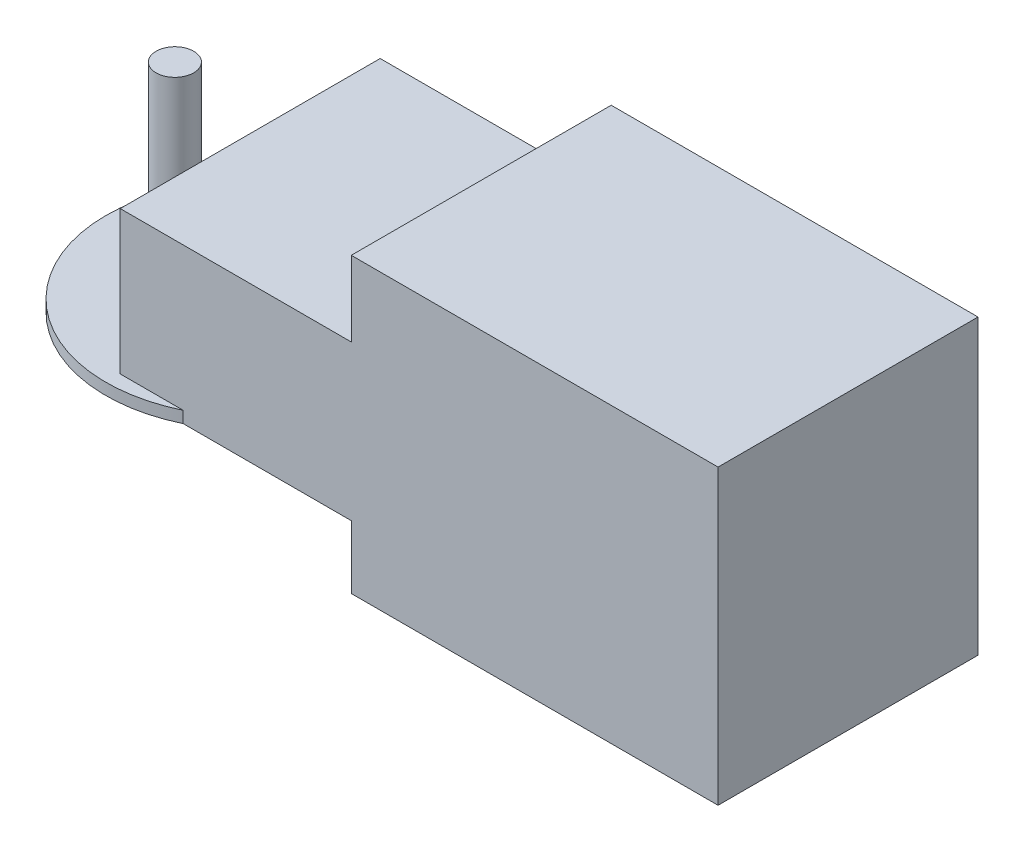
ISO-10303-21;
HEADER;
FILE_DESCRIPTION(('STEP AP214'),'2;1');
FILE_NAME('part.step','',(''),(''),'','','');
FILE_SCHEMA(('AUTOMOTIVE_DESIGN { 1 0 10303 214 1 1 1 1 }'));
ENDSEC;
DATA;
#1=APPLICATION_CONTEXT('core data for automotive mechanical design processes');
#2=APPLICATION_PROTOCOL_DEFINITION('international standard','automotive_design',2000,#1);
#3=PRODUCT_CONTEXT('',#1,'mechanical');
#4=PRODUCT('Part','Part','',(#3));
#5=PRODUCT_RELATED_PRODUCT_CATEGORY('part','',(#4));
#6=PRODUCT_DEFINITION_FORMATION('','',#4);
#7=PRODUCT_DEFINITION_CONTEXT('part definition',#1,'design');
#8=PRODUCT_DEFINITION('design','',#6,#7);
#9=PRODUCT_DEFINITION_SHAPE('','',#8);
#10=(LENGTH_UNIT() NAMED_UNIT(*) SI_UNIT(.MILLI.,.METRE.));
#11=(NAMED_UNIT(*) PLANE_ANGLE_UNIT() SI_UNIT($,.RADIAN.));
#12=(NAMED_UNIT(*) SI_UNIT($,.STERADIAN.) SOLID_ANGLE_UNIT());
#13=UNCERTAINTY_MEASURE_WITH_UNIT(LENGTH_MEASURE(1.E-05),#10,'distance_accuracy_value','');
#14=(GEOMETRIC_REPRESENTATION_CONTEXT(3) GLOBAL_UNCERTAINTY_ASSIGNED_CONTEXT((#13)) GLOBAL_UNIT_ASSIGNED_CONTEXT((#10,
#11,#12)) REPRESENTATION_CONTEXT('',''));
#15=CARTESIAN_POINT('',(0.,0.,0.));
#16=DIRECTION('',(0.,0.,1.));
#17=DIRECTION('',(1.,0.,0.));
#18=AXIS2_PLACEMENT_3D('',#15,#16,#17);
#19=CARTESIAN_POINT('',(-71.75,44.5841200930065,0.));
#20=DIRECTION('',(-1.,0.,0.));
#21=DIRECTION('',(0.,0.,1.));
#22=AXIS2_PLACEMENT_3D('',#19,#20,#21);
#23=PLANE('',#22);
#24=DIRECTION('',(0.,-1.,0.));
#25=VECTOR('',#24,1.);
#26=CARTESIAN_POINT('',(-71.75,44.5841200930065,0.));
#27=LINE('',#26,#25);
#28=CARTESIAN_POINT('',(-71.75,44.5841200930065,0.));
#29=VERTEX_POINT('',#28);
#30=CARTESIAN_POINT('',(-71.75,19.7887657512741,0.));
#31=VERTEX_POINT('',#30);
#32=EDGE_CURVE('E191',#29,#31,#27,.T.);
#33=ORIENTED_EDGE('',*,*,#32,.T.);
#34=DIRECTION('',(0.,0.,1.));
#35=VECTOR('',#34,1.);
#36=CARTESIAN_POINT('',(-71.75,19.7887657512741,0.));
#37=LINE('',#36,#35);
#38=CARTESIAN_POINT('',(-71.75,19.7887657512741,45.));
#39=VERTEX_POINT('',#38);
#40=EDGE_CURVE('E55',#31,#39,#37,.T.);
#41=ORIENTED_EDGE('',*,*,#40,.T.);
#42=DIRECTION('',(0.,-1.,0.));
#43=VECTOR('',#42,1.);
#44=CARTESIAN_POINT('',(-71.75,44.5841200930065,45.));
#45=LINE('',#44,#43);
#46=CARTESIAN_POINT('',(-71.75,44.5841200930065,45.));
#47=VERTEX_POINT('',#46);
#48=EDGE_CURVE('E350',#47,#39,#45,.T.);
#49=ORIENTED_EDGE('',*,*,#48,.F.);
#50=DIRECTION('',(0.,0.,1.));
#51=VECTOR('',#50,1.);
#52=CARTESIAN_POINT('',(-71.75,44.5841200930065,0.));
#53=LINE('',#52,#51);
#54=EDGE_CURVE('E291',#29,#47,#53,.T.);
#55=ORIENTED_EDGE('',*,*,#54,.F.);
#56=EDGE_LOOP('',(#33,#41,#49,#55));
#57=FACE_BOUND('',#56,.T.);
#58=ADVANCED_FACE('F45',(#57),#23,.T.);
#59=CARTESIAN_POINT('',(-31.75,0.,40.));
#60=DIRECTION('',(-1.,0.,0.));
#61=DIRECTION('',(0.,0.,1.));
#62=AXIS2_PLACEMENT_3D('',#59,#60,#61);
#63=PLANE('',#62);
#64=DIRECTION('',(0.,1.,0.));
#65=VECTOR('',#64,1.);
#66=CARTESIAN_POINT('',(-31.75,0.,0.));
#67=LINE('',#66,#65);
#68=CARTESIAN_POINT('',(-31.75,44.5841200930065,0.));
#69=VERTEX_POINT('',#68);
#70=CARTESIAN_POINT('',(-31.75,57.5788118988596,0.));
#71=VERTEX_POINT('',#70);
#72=EDGE_CURVE('E208',#69,#71,#67,.T.);
#73=ORIENTED_EDGE('',*,*,#72,.F.);
#74=DIRECTION('',(0.,0.,1.));
#75=VECTOR('',#74,1.);
#76=CARTESIAN_POINT('',(-31.75,44.5841200930065,0.));
#77=LINE('',#76,#75);
#78=CARTESIAN_POINT('',(-31.75,44.5841200930065,45.));
#79=VERTEX_POINT('',#78);
#80=EDGE_CURVE('E201',#69,#79,#77,.T.);
#81=ORIENTED_EDGE('',*,*,#80,.T.);
#82=DIRECTION('',(0.,-1.,0.));
#83=VECTOR('',#82,1.);
#84=CARTESIAN_POINT('',(-31.75,6.86545373748349,45.));
#85=LINE('',#84,#83);
#86=CARTESIAN_POINT('',(-31.75,57.5788118988596,45.));
#87=VERTEX_POINT('',#86);
#88=EDGE_CURVE('E315',#87,#79,#85,.T.);
#89=ORIENTED_EDGE('',*,*,#88,.F.);
#90=DIRECTION('',(0.,0.,-1.));
#91=VECTOR('',#90,1.);
#92=CARTESIAN_POINT('',(-31.75,57.5788118988596,40.));
#93=LINE('',#92,#91);
#94=EDGE_CURVE('E245',#87,#71,#93,.T.);
#95=ORIENTED_EDGE('',*,*,#94,.T.);
#96=EDGE_LOOP('',(#73,#81,#89,#95));
#97=FACE_BOUND('',#96,.T.);
#98=ADVANCED_FACE('F342',(#97),#63,.T.);
#99=CARTESIAN_POINT('',(0.,0.,40.));
#100=DIRECTION('',(0.,0.,1.));
#101=DIRECTION('',(1.,0.,0.));
#102=AXIS2_PLACEMENT_3D('',#99,#100,#101);
#103=PLANE('',#102);
#104=DIRECTION('',(1.,0.,0.));
#105=VECTOR('',#104,1.);
#106=CARTESIAN_POINT('',(31.75,6.86545373748349,40.));
#107=LINE('',#106,#105);
#108=CARTESIAN_POINT('',(-26.3438104142538,6.86545373748349,40.));
#109=VERTEX_POINT('',#108);
#110=CARTESIAN_POINT('',(-20.2372816356347,6.86545373748349,40.));
#111=VERTEX_POINT('',#110);
#112=EDGE_CURVE('E273',#109,#111,#107,.T.);
#113=ORIENTED_EDGE('',*,*,#112,.F.);
#114=DIRECTION('',(0.,1.,0.));
#115=VECTOR('',#114,1.);
#116=CARTESIAN_POINT('',(-26.3438104142538,0.,40.));
#117=LINE('',#116,#115);
#118=CARTESIAN_POINT('',(-26.3438104142538,5.08745373748349,40.));
#119=VERTEX_POINT('',#118);
#120=EDGE_CURVE('E503',#119,#109,#117,.T.);
#121=ORIENTED_EDGE('',*,*,#120,.F.);
#122=DIRECTION('',(-1.,0.,0.));
#123=VECTOR('',#122,1.);
#124=CARTESIAN_POINT('',(0.,5.08745373748349,40.));
#125=LINE('',#124,#123);
#126=CARTESIAN_POINT('',(-21.2638104142538,5.08745373748349,40.));
#127=VERTEX_POINT('',#126);
#128=EDGE_CURVE('E499',#127,#119,#125,.T.);
#129=ORIENTED_EDGE('',*,*,#128,.F.);
#130=DIRECTION('',(0.499999999999998,0.86602540378444,0.));
#131=VECTOR('',#130,1.);
#132=CARTESIAN_POINT('',(-18.1507898993098,10.4793634343708,40.));
#133=LINE('',#132,#131);
#134=EDGE_CURVE('E233',#127,#111,#133,.T.);
#135=ORIENTED_EDGE('',*,*,#134,.T.);
#136=EDGE_LOOP('',(#113,#121,#129,#135));
#137=FACE_BOUND('',#136,.T.);
#138=ADVANCED_FACE('F424',(#137),#103,.T.);
#139=CARTESIAN_POINT('',(0.,41.9174537374835,40.));
#140=DIRECTION('',(0.,0.,-1.));
#141=DIRECTION('',(-1.,0.,0.));
#142=AXIS2_PLACEMENT_3D('',#139,#140,#141);
#143=CYLINDRICAL_SURFACE('',#142,10.16);
#144=CARTESIAN_POINT('',(0.,41.9174537374835,0.));
#145=DIRECTION('',(0.,0.,1.));
#146=DIRECTION('',(1.,0.,0.));
#147=AXIS2_PLACEMENT_3D('',#144,#145,#146);
#148=CIRCLE('',#147,10.16);
#149=CARTESIAN_POINT('',(5.07999999999998,33.1186356350336,0.));
#150=VERTEX_POINT('',#149);
#151=CARTESIAN_POINT('',(-5.07999999999998,33.1186356350336,0.));
#152=VERTEX_POINT('',#151);
#153=EDGE_CURVE('E318',#150,#152,#148,.T.);
#154=ORIENTED_EDGE('',*,*,#153,.F.);
#155=DIRECTION('',(0.,0.,-1.));
#156=VECTOR('',#155,1.);
#157=CARTESIAN_POINT('',(5.07999999999998,33.1186356350336,40.));
#158=LINE('',#157,#156);
#159=CARTESIAN_POINT('',(5.07999999999998,33.1186356350336,40.));
#160=VERTEX_POINT('',#159);
#161=EDGE_CURVE('E269',#160,#150,#158,.T.);
#162=ORIENTED_EDGE('',*,*,#161,.F.);
#163=CARTESIAN_POINT('',(0.,41.9174537374835,40.));
#164=DIRECTION('',(0.,0.,1.));
#165=DIRECTION('',(1.,0.,0.));
#166=AXIS2_PLACEMENT_3D('',#163,#164,#165);
#167=CIRCLE('',#166,10.16);
#168=CARTESIAN_POINT('',(-5.07999999999998,33.1186356350336,40.));
#169=VERTEX_POINT('',#168);
#170=EDGE_CURVE('E228',#160,#169,#167,.T.);
#171=ORIENTED_EDGE('',*,*,#170,.T.);
#172=DIRECTION('',(0.,0.,-1.));
#173=VECTOR('',#172,1.);
#174=CARTESIAN_POINT('',(-5.07999999999998,33.1186356350336,40.));
#175=LINE('',#174,#173);
#176=EDGE_CURVE('E229',#169,#152,#175,.T.);
#177=ORIENTED_EDGE('',*,*,#176,.T.);
#178=EDGE_LOOP('',(#154,#162,#171,#177));
#179=FACE_BOUND('',#178,.T.);
#180=ADVANCED_FACE('F47',(#179),#143,.F.);
#181=CARTESIAN_POINT('',(18.1507898993098,10.4793634343708,40.));
#182=DIRECTION('',(0.86602540378444,0.499999999999998,0.));
#183=DIRECTION('',(-0.499999999999998,0.86602540378444,0.));
#184=AXIS2_PLACEMENT_3D('',#181,#182,#183);
#185=PLANE('',#184);
#186=DIRECTION('',(0.499999999999998,-0.86602540378444,0.));
#187=VECTOR('',#186,1.);
#188=CARTESIAN_POINT('',(18.1507898993098,10.4793634343708,0.));
#189=LINE('',#188,#187);
#190=CARTESIAN_POINT('',(21.2638104142538,5.08745373748349,0.));
#191=VERTEX_POINT('',#190);
#192=EDGE_CURVE('E323',#150,#191,#189,.T.);
#193=ORIENTED_EDGE('',*,*,#192,.T.);
#194=DIRECTION('',(0.,0.,-1.));
#195=VECTOR('',#194,1.);
#196=CARTESIAN_POINT('',(21.2638104142538,5.08745373748349,40.));
#197=LINE('',#196,#195);
#198=CARTESIAN_POINT('',(21.2638104142538,5.08745373748349,40.));
#199=VERTEX_POINT('',#198);
#200=EDGE_CURVE('E265',#199,#191,#197,.T.);
#201=ORIENTED_EDGE('',*,*,#200,.F.);
#202=DIRECTION('',(0.499999999999998,-0.86602540378444,0.));
#203=VECTOR('',#202,1.);
#204=CARTESIAN_POINT('',(18.1507898993098,10.4793634343708,40.));
#205=LINE('',#204,#203);
#206=CARTESIAN_POINT('',(20.2372816356346,6.86545373748349,40.));
#207=VERTEX_POINT('',#206);
#208=EDGE_CURVE('E515',#207,#199,#205,.T.);
#209=ORIENTED_EDGE('',*,*,#208,.F.);
#210=EDGE_CURVE('E512',#160,#207,#205,.T.);
#211=ORIENTED_EDGE('',*,*,#210,.F.);
#212=ORIENTED_EDGE('',*,*,#161,.T.);
#213=EDGE_LOOP('',(#193,#201,#209,#211,#212));
#214=FACE_BOUND('',#213,.T.);
#215=ADVANCED_FACE('F463',(#214),#185,.F.);
#216=CARTESIAN_POINT('',(0.,5.08745373748349,40.));
#217=DIRECTION('',(0.,1.,0.));
#218=DIRECTION('',(0.,0.,1.));
#219=AXIS2_PLACEMENT_3D('',#216,#217,#218);
#220=PLANE('',#219);
#221=DIRECTION('',(1.,0.,0.));
#222=VECTOR('',#221,1.);
#223=CARTESIAN_POINT('',(0.,5.08745373748349,0.));
#224=LINE('',#223,#222);
#225=CARTESIAN_POINT('',(26.3438104142538,5.08745373748349,0.));
#226=VERTEX_POINT('',#225);
#227=EDGE_CURVE('E479',#191,#226,#224,.T.);
#228=ORIENTED_EDGE('',*,*,#227,.T.);
#229=DIRECTION('',(0.,0.,-1.));
#230=VECTOR('',#229,1.);
#231=CARTESIAN_POINT('',(26.3438104142538,5.08745373748349,40.));
#232=LINE('',#231,#230);
#233=CARTESIAN_POINT('',(26.3438104142538,5.08745373748349,40.));
#234=VERTEX_POINT('',#233);
#235=EDGE_CURVE('E261',#234,#226,#232,.T.);
#236=ORIENTED_EDGE('',*,*,#235,.F.);
#237=DIRECTION('',(1.,0.,0.));
#238=VECTOR('',#237,1.);
#239=CARTESIAN_POINT('',(0.,5.08745373748349,40.));
#240=LINE('',#239,#238);
#241=EDGE_CURVE('E482',#199,#234,#240,.T.);
#242=ORIENTED_EDGE('',*,*,#241,.F.);
#243=ORIENTED_EDGE('',*,*,#200,.T.);
#244=EDGE_LOOP('',(#228,#236,#242,#243));
#245=FACE_BOUND('',#244,.T.);
#246=ADVANCED_FACE('F460',(#245),#220,.F.);
#247=CARTESIAN_POINT('',(26.3438104142538,0.,40.));
#248=DIRECTION('',(-1.,0.,0.));
#249=DIRECTION('',(0.,-1.,0.));
#250=AXIS2_PLACEMENT_3D('',#247,#248,#249);
#251=PLANE('',#250);
#252=DIRECTION('',(0.,1.,0.));
#253=VECTOR('',#252,1.);
#254=CARTESIAN_POINT('',(26.3438104142538,0.,0.));
#255=LINE('',#254,#253);
#256=CARTESIAN_POINT('',(26.3438104142538,6.86545373748349,0.));
#257=VERTEX_POINT('',#256);
#258=EDGE_CURVE('E484',#226,#257,#255,.T.);
#259=ORIENTED_EDGE('',*,*,#258,.T.);
#260=DIRECTION('',(0.,0.,-1.));
#261=VECTOR('',#260,1.);
#262=CARTESIAN_POINT('',(26.3438104142538,6.86545373748349,40.));
#263=LINE('',#262,#261);
#264=CARTESIAN_POINT('',(26.3438104142538,6.86545373748349,40.));
#265=VERTEX_POINT('',#264);
#266=EDGE_CURVE('E257',#265,#257,#263,.T.);
#267=ORIENTED_EDGE('',*,*,#266,.F.);
#268=DIRECTION('',(0.,1.,0.));
#269=VECTOR('',#268,1.);
#270=CARTESIAN_POINT('',(26.3438104142538,0.,40.));
#271=LINE('',#270,#269);
#272=EDGE_CURVE('E507',#234,#265,#271,.T.);
#273=ORIENTED_EDGE('',*,*,#272,.F.);
#274=ORIENTED_EDGE('',*,*,#235,.T.);
#275=EDGE_LOOP('',(#259,#267,#273,#274));
#276=FACE_BOUND('',#275,.T.);
#277=ADVANCED_FACE('F457',(#276),#251,.F.);
#278=CARTESIAN_POINT('',(31.75,0.,40.));
#279=DIRECTION('',(-1.,0.,0.));
#280=DIRECTION('',(0.,0.,1.));
#281=AXIS2_PLACEMENT_3D('',#278,#279,#280);
#282=PLANE('',#281);
#283=DIRECTION('',(0.,1.,0.));
#284=VECTOR('',#283,1.);
#285=CARTESIAN_POINT('',(31.75,0.,0.));
#286=LINE('',#285,#284);
#287=CARTESIAN_POINT('',(31.75,6.86545373748349,0.));
#288=VERTEX_POINT('',#287);
#289=CARTESIAN_POINT('',(31.75,57.5788118988596,0.));
#290=VERTEX_POINT('',#289);
#291=EDGE_CURVE('E491',#288,#290,#286,.T.);
#292=ORIENTED_EDGE('',*,*,#291,.T.);
#293=DIRECTION('',(0.,0.,-1.));
#294=VECTOR('',#293,1.);
#295=CARTESIAN_POINT('',(31.75,57.5788118988596,40.));
#296=LINE('',#295,#294);
#297=CARTESIAN_POINT('',(31.75,57.5788118988596,45.));
#298=VERTEX_POINT('',#297);
#299=EDGE_CURVE('E249',#298,#290,#296,.T.);
#300=ORIENTED_EDGE('',*,*,#299,.F.);
#301=DIRECTION('',(0.,1.,0.));
#302=VECTOR('',#301,1.);
#303=CARTESIAN_POINT('',(31.75,57.5788118988596,45.));
#304=LINE('',#303,#302);
#305=CARTESIAN_POINT('',(31.75,6.86545373748349,45.));
#306=VERTEX_POINT('',#305);
#307=EDGE_CURVE('E296',#306,#298,#304,.T.);
#308=ORIENTED_EDGE('',*,*,#307,.F.);
#309=DIRECTION('',(0.,0.,-1.));
#310=VECTOR('',#309,1.);
#311=CARTESIAN_POINT('',(31.75,6.86545373748349,40.));
#312=LINE('',#311,#310);
#313=EDGE_CURVE('E253',#306,#288,#312,.T.);
#314=ORIENTED_EDGE('',*,*,#313,.T.);
#315=EDGE_LOOP('',(#292,#300,#308,#314));
#316=FACE_BOUND('',#315,.T.);
#317=ADVANCED_FACE('F334',(#316),#282,.F.);
#318=CARTESIAN_POINT('',(0.,57.5788118988596,40.));
#319=DIRECTION('',(0.,-1.,0.));
#320=DIRECTION('',(0.,0.,-1.));
#321=AXIS2_PLACEMENT_3D('',#318,#319,#320);
#322=PLANE('',#321);
#323=DIRECTION('',(-1.,0.,0.));
#324=VECTOR('',#323,1.);
#325=CARTESIAN_POINT('',(0.,57.5788118988596,0.));
#326=LINE('',#325,#324);
#327=EDGE_CURVE('E214',#290,#71,#326,.T.);
#328=ORIENTED_EDGE('',*,*,#327,.T.);
#329=ORIENTED_EDGE('',*,*,#94,.F.);
#330=DIRECTION('',(-1.,0.,0.));
#331=VECTOR('',#330,1.);
#332=CARTESIAN_POINT('',(-31.75,57.5788118988596,45.));
#333=LINE('',#332,#331);
#334=EDGE_CURVE('E312',#298,#87,#333,.T.);
#335=ORIENTED_EDGE('',*,*,#334,.F.);
#336=ORIENTED_EDGE('',*,*,#299,.T.);
#337=EDGE_LOOP('',(#328,#329,#335,#336));
#338=FACE_BOUND('',#337,.T.);
#339=ADVANCED_FACE('F338',(#338),#322,.F.);
#340=DIRECTION('',(0.,0.,1.));
#341=VECTOR('',#340,1.);
#342=CARTESIAN_POINT('',(-31.75,17.7887657512741,0.));
#343=LINE('',#342,#341);
#344=CARTESIAN_POINT('',(-31.75,17.7887657512741,0.));
#345=VERTEX_POINT('',#344);
#346=CARTESIAN_POINT('',(-31.75,17.7887657512741,45.));
#347=VERTEX_POINT('',#346);
#348=EDGE_CURVE('E184',#345,#347,#343,.T.);
#349=ORIENTED_EDGE('',*,*,#348,.F.);
#350=CARTESIAN_POINT('',(-31.75,6.86545373748349,0.));
#351=VERTEX_POINT('',#350);
#352=EDGE_CURVE('E197',#351,#345,#67,.T.);
#353=ORIENTED_EDGE('',*,*,#352,.F.);
#354=DIRECTION('',(0.,0.,-1.));
#355=VECTOR('',#354,1.);
#356=CARTESIAN_POINT('',(-31.75,6.86545373748349,40.));
#357=LINE('',#356,#355);
#358=CARTESIAN_POINT('',(-31.75,6.86545373748349,45.));
#359=VERTEX_POINT('',#358);
#360=EDGE_CURVE('E242',#359,#351,#357,.T.);
#361=ORIENTED_EDGE('',*,*,#360,.F.);
#362=EDGE_CURVE('E199',#347,#359,#85,.T.);
#363=ORIENTED_EDGE('',*,*,#362,.F.);
#364=EDGE_LOOP('',(#349,#353,#361,#363));
#365=FACE_BOUND('',#364,.T.);
#366=ADVANCED_FACE('F195',(#365),#63,.T.);
#367=CARTESIAN_POINT('',(0.,6.86545373748349,40.));
#368=DIRECTION('',(0.,-1.,0.));
#369=DIRECTION('',(0.,0.,-1.));
#370=AXIS2_PLACEMENT_3D('',#367,#368,#369);
#371=PLANE('',#370);
#372=DIRECTION('',(-1.,0.,0.));
#373=VECTOR('',#372,1.);
#374=CARTESIAN_POINT('',(0.,6.86545373748349,0.));
#375=LINE('',#374,#373);
#376=CARTESIAN_POINT('',(-26.3438104142538,6.86545373748349,0.));
#377=VERTEX_POINT('',#376);
#378=EDGE_CURVE('E206',#377,#351,#375,.T.);
#379=ORIENTED_EDGE('',*,*,#378,.F.);
#380=DIRECTION('',(0.,0.,-1.));
#381=VECTOR('',#380,1.);
#382=CARTESIAN_POINT('',(-26.3438104142538,6.86545373748349,40.));
#383=LINE('',#382,#381);
#384=EDGE_CURVE('E239',#109,#377,#383,.T.);
#385=ORIENTED_EDGE('',*,*,#384,.F.);
#386=ORIENTED_EDGE('',*,*,#112,.T.);
#387=EDGE_CURVE('E281',#111,#207,#107,.T.);
#388=ORIENTED_EDGE('',*,*,#387,.T.);
#389=EDGE_CURVE('E271',#207,#265,#107,.T.);
#390=ORIENTED_EDGE('',*,*,#389,.T.);
#391=ORIENTED_EDGE('',*,*,#266,.T.);
#392=DIRECTION('',(1.,0.,0.));
#393=VECTOR('',#392,1.);
#394=CARTESIAN_POINT('',(0.,6.86545373748349,0.));
#395=LINE('',#394,#393);
#396=EDGE_CURVE('E331',#257,#288,#395,.T.);
#397=ORIENTED_EDGE('',*,*,#396,.T.);
#398=ORIENTED_EDGE('',*,*,#313,.F.);
#399=DIRECTION('',(1.,0.,0.));
#400=VECTOR('',#399,1.);
#401=CARTESIAN_POINT('',(31.75,6.86545373748349,45.));
#402=LINE('',#401,#400);
#403=EDGE_CURVE('E290',#359,#306,#402,.T.);
#404=ORIENTED_EDGE('',*,*,#403,.F.);
#405=ORIENTED_EDGE('',*,*,#360,.T.);
#406=EDGE_LOOP('',(#379,#385,#386,#388,#390,#391,#397,#398,#404,#405));
#407=FACE_BOUND('',#406,.T.);
#408=ADVANCED_FACE('F328',(#407),#371,.T.);
#409=CARTESIAN_POINT('',(-26.3438104142538,0.,40.));
#410=DIRECTION('',(-1.,0.,0.));
#411=DIRECTION('',(0.,0.,1.));
#412=AXIS2_PLACEMENT_3D('',#409,#410,#411);
#413=PLANE('',#412);
#414=DIRECTION('',(0.,1.,0.));
#415=VECTOR('',#414,1.);
#416=CARTESIAN_POINT('',(-26.3438104142538,0.,0.));
#417=LINE('',#416,#415);
#418=CARTESIAN_POINT('',(-26.3438104142538,5.08745373748349,0.));
#419=VERTEX_POINT('',#418);
#420=EDGE_CURVE('E212',#419,#377,#417,.T.);
#421=ORIENTED_EDGE('',*,*,#420,.F.);
#422=DIRECTION('',(0.,0.,-1.));
#423=VECTOR('',#422,1.);
#424=CARTESIAN_POINT('',(-26.3438104142538,5.08745373748349,40.));
#425=LINE('',#424,#423);
#426=EDGE_CURVE('E236',#119,#419,#425,.T.);
#427=ORIENTED_EDGE('',*,*,#426,.F.);
#428=ORIENTED_EDGE('',*,*,#120,.T.);
#429=ORIENTED_EDGE('',*,*,#384,.T.);
#430=EDGE_LOOP('',(#421,#427,#428,#429));
#431=FACE_BOUND('',#430,.T.);
#432=ADVANCED_FACE('F445',(#431),#413,.T.);
#433=CARTESIAN_POINT('',(0.,5.08745373748349,40.));
#434=DIRECTION('',(0.,-1.,0.));
#435=DIRECTION('',(1.,0.,0.));
#436=AXIS2_PLACEMENT_3D('',#433,#434,#435);
#437=PLANE('',#436);
#438=DIRECTION('',(-1.,0.,0.));
#439=VECTOR('',#438,1.);
#440=CARTESIAN_POINT('',(0.,5.08745373748349,0.));
#441=LINE('',#440,#439);
#442=CARTESIAN_POINT('',(-21.2638104142538,5.08745373748349,0.));
#443=VERTEX_POINT('',#442);
#444=EDGE_CURVE('E220',#443,#419,#441,.T.);
#445=ORIENTED_EDGE('',*,*,#444,.F.);
#446=DIRECTION('',(0.,0.,-1.));
#447=VECTOR('',#446,1.);
#448=CARTESIAN_POINT('',(-21.2638104142538,5.08745373748349,40.));
#449=LINE('',#448,#447);
#450=EDGE_CURVE('E232',#127,#443,#449,.T.);
#451=ORIENTED_EDGE('',*,*,#450,.F.);
#452=ORIENTED_EDGE('',*,*,#128,.T.);
#453=ORIENTED_EDGE('',*,*,#426,.T.);
#454=EDGE_LOOP('',(#445,#451,#452,#453));
#455=FACE_BOUND('',#454,.T.);
#456=ADVANCED_FACE('F441',(#455),#437,.T.);
#457=CARTESIAN_POINT('',(-18.1507898993098,10.4793634343708,40.));
#458=DIRECTION('',(-0.86602540378444,0.499999999999998,0.));
#459=DIRECTION('',(-0.499999999999998,-0.86602540378444,0.));
#460=AXIS2_PLACEMENT_3D('',#457,#458,#459);
#461=PLANE('',#460);
#462=DIRECTION('',(0.499999999999998,0.86602540378444,0.));
#463=VECTOR('',#462,1.);
#464=CARTESIAN_POINT('',(-18.1507898993098,10.4793634343708,0.));
#465=LINE('',#464,#463);
#466=EDGE_CURVE('E224',#443,#152,#465,.T.);
#467=ORIENTED_EDGE('',*,*,#466,.T.);
#468=ORIENTED_EDGE('',*,*,#176,.F.);
#469=EDGE_CURVE('E498',#111,#169,#133,.T.);
#470=ORIENTED_EDGE('',*,*,#469,.F.);
#471=ORIENTED_EDGE('',*,*,#134,.F.);
#472=ORIENTED_EDGE('',*,*,#450,.T.);
#473=EDGE_LOOP('',(#467,#468,#470,#471,#472));
#474=FACE_BOUND('',#473,.T.);
#475=ADVANCED_FACE('F436',(#474),#461,.F.);
#476=ORIENTED_EDGE('',*,*,#389,.F.);
#477=ORIENTED_EDGE('',*,*,#208,.T.);
#478=ORIENTED_EDGE('',*,*,#241,.T.);
#479=ORIENTED_EDGE('',*,*,#272,.T.);
#480=EDGE_LOOP('',(#476,#477,#478,#479));
#481=FACE_BOUND('',#480,.T.);
#482=ADVANCED_FACE('F433',(#481),#103,.T.);
#483=CARTESIAN_POINT('',(0.,0.,0.));
#484=DIRECTION('',(0.,0.,1.));
#485=DIRECTION('',(1.,0.,0.));
#486=AXIS2_PLACEMENT_3D('',#483,#484,#485);
#487=PLANE('',#486);
#488=DIRECTION('',(1.,0.,0.));
#489=VECTOR('',#488,1.);
#490=CARTESIAN_POINT('',(-71.75,17.7887657512741,0.));
#491=LINE('',#490,#489);
#492=CARTESIAN_POINT('',(-60.8527526411483,17.7887657512741,0.));
#493=VERTEX_POINT('',#492);
#494=EDGE_CURVE('E180',#493,#345,#491,.T.);
#495=ORIENTED_EDGE('',*,*,#494,.F.);
#496=DIRECTION('',(0.,-1.,0.));
#497=VECTOR('',#496,1.);
#498=CARTESIAN_POINT('',(-60.8527526411483,19.7887657512741,0.));
#499=LINE('',#498,#497);
#500=CARTESIAN_POINT('',(-60.8527526411483,19.7887657512741,0.));
#501=VERTEX_POINT('',#500);
#502=EDGE_CURVE('E63',#493,#501,#499,.F.);
#503=ORIENTED_EDGE('',*,*,#502,.T.);
#504=DIRECTION('',(1.,0.,0.));
#505=VECTOR('',#504,1.);
#506=CARTESIAN_POINT('',(0.,19.7887657512741,0.));
#507=LINE('',#506,#505);
#508=EDGE_CURVE('E352',#31,#501,#507,.T.);
#509=ORIENTED_EDGE('',*,*,#508,.F.);
#510=ORIENTED_EDGE('',*,*,#32,.F.);
#511=DIRECTION('',(1.,0.,0.));
#512=VECTOR('',#511,1.);
#513=CARTESIAN_POINT('',(-71.75,44.5841200930065,0.));
#514=LINE('',#513,#512);
#515=EDGE_CURVE('E190',#29,#69,#514,.T.);
#516=ORIENTED_EDGE('',*,*,#515,.T.);
#517=ORIENTED_EDGE('',*,*,#72,.T.);
#518=ORIENTED_EDGE('',*,*,#327,.F.);
#519=ORIENTED_EDGE('',*,*,#291,.F.);
#520=ORIENTED_EDGE('',*,*,#396,.F.);
#521=ORIENTED_EDGE('',*,*,#258,.F.);
#522=ORIENTED_EDGE('',*,*,#227,.F.);
#523=ORIENTED_EDGE('',*,*,#192,.F.);
#524=ORIENTED_EDGE('',*,*,#153,.T.);
#525=ORIENTED_EDGE('',*,*,#466,.F.);
#526=ORIENTED_EDGE('',*,*,#444,.T.);
#527=ORIENTED_EDGE('',*,*,#420,.T.);
#528=ORIENTED_EDGE('',*,*,#378,.T.);
#529=ORIENTED_EDGE('',*,*,#352,.T.);
#530=EDGE_LOOP('',(#495,#503,#509,#510,#516,#517,#518,#519,#520,#521,#522,#523,#524,#525,#526,
#527,#528,#529));
#531=FACE_BOUND('',#530,.T.);
#532=ADVANCED_FACE('F203',(#531),#487,.F.);
#533=CARTESIAN_POINT('',(0.,0.,45.));
#534=DIRECTION('',(0.,0.,-1.));
#535=DIRECTION('',(-1.,0.,0.));
#536=AXIS2_PLACEMENT_3D('',#533,#534,#535);
#537=PLANE('',#536);
#538=DIRECTION('',(-1.,0.,0.));
#539=VECTOR('',#538,1.);
#540=CARTESIAN_POINT('',(0.,19.7887657512741,45.));
#541=LINE('',#540,#539);
#542=CARTESIAN_POINT('',(-60.8527526411483,19.7887657512741,45.));
#543=VERTEX_POINT('',#542);
#544=EDGE_CURVE('E71',#543,#39,#541,.T.);
#545=ORIENTED_EDGE('',*,*,#544,.F.);
#546=DIRECTION('',(0.,-1.,0.));
#547=VECTOR('',#546,1.);
#548=CARTESIAN_POINT('',(-60.8527526411483,19.7887657512741,45.));
#549=LINE('',#548,#547);
#550=CARTESIAN_POINT('',(-60.8527526411483,17.7887657512741,45.));
#551=VERTEX_POINT('',#550);
#552=EDGE_CURVE('E363',#543,#551,#549,.T.);
#553=ORIENTED_EDGE('',*,*,#552,.T.);
#554=DIRECTION('',(1.,0.,0.));
#555=VECTOR('',#554,1.);
#556=CARTESIAN_POINT('',(-71.75,17.7887657512741,45.));
#557=LINE('',#556,#555);
#558=EDGE_CURVE('E327',#551,#347,#557,.T.);
#559=ORIENTED_EDGE('',*,*,#558,.T.);
#560=ORIENTED_EDGE('',*,*,#362,.T.);
#561=ORIENTED_EDGE('',*,*,#403,.T.);
#562=ORIENTED_EDGE('',*,*,#307,.T.);
#563=ORIENTED_EDGE('',*,*,#334,.T.);
#564=ORIENTED_EDGE('',*,*,#88,.T.);
#565=DIRECTION('',(1.,0.,0.));
#566=VECTOR('',#565,1.);
#567=CARTESIAN_POINT('',(-71.75,44.5841200930065,45.));
#568=LINE('',#567,#566);
#569=EDGE_CURVE('E306',#47,#79,#568,.T.);
#570=ORIENTED_EDGE('',*,*,#569,.F.);
#571=ORIENTED_EDGE('',*,*,#48,.T.);
#572=EDGE_LOOP('',(#545,#553,#559,#560,#561,#562,#563,#564,#570,#571));
#573=FACE_BOUND('',#572,.T.);
#574=ADVANCED_FACE('F325',(#573),#537,.F.);
#575=CARTESIAN_POINT('',(0.,0.,40.));
#576=DIRECTION('',(0.,0.,-1.));
#577=DIRECTION('',(-1.,0.,0.));
#578=AXIS2_PLACEMENT_3D('',#575,#576,#577);
#579=PLANE('',#578);
#580=ORIENTED_EDGE('',*,*,#170,.F.);
#581=ORIENTED_EDGE('',*,*,#210,.T.);
#582=ORIENTED_EDGE('',*,*,#387,.F.);
#583=ORIENTED_EDGE('',*,*,#469,.T.);
#584=EDGE_LOOP('',(#580,#581,#582,#583));
#585=FACE_BOUND('',#584,.T.);
#586=ADVANCED_FACE('F429',(#585),#579,.T.);
#587=CARTESIAN_POINT('',(-71.75,44.5841200930065,0.));
#588=DIRECTION('',(0.,-1.,0.));
#589=DIRECTION('',(0.,0.,-1.));
#590=AXIS2_PLACEMENT_3D('',#587,#588,#589);
#591=PLANE('',#590);
#592=ORIENTED_EDGE('',*,*,#569,.T.);
#593=ORIENTED_EDGE('',*,*,#80,.F.);
#594=ORIENTED_EDGE('',*,*,#515,.F.);
#595=ORIENTED_EDGE('',*,*,#54,.T.);
#596=EDGE_LOOP('',(#592,#593,#594,#595));
#597=FACE_BOUND('',#596,.T.);
#598=ADVANCED_FACE('F344',(#597),#591,.F.);
#599=CARTESIAN_POINT('',(-71.75,17.7887657512741,0.));
#600=DIRECTION('',(0.,-1.,0.));
#601=DIRECTION('',(0.,0.,-1.));
#602=AXIS2_PLACEMENT_3D('',#599,#600,#601);
#603=PLANE('',#602);
#604=CARTESIAN_POINT('',(-71.75,17.7887657512741,22.5));
#605=DIRECTION('',(0.,-1.,0.));
#606=DIRECTION('',(0.,0.,-1.));
#607=AXIS2_PLACEMENT_3D('',#604,#605,#606);
#608=CIRCLE('',#607,25.);
#609=EDGE_CURVE('E187',#551,#493,#608,.T.);
#610=ORIENTED_EDGE('',*,*,#609,.T.);
#611=ORIENTED_EDGE('',*,*,#494,.T.);
#612=ORIENTED_EDGE('',*,*,#348,.T.);
#613=ORIENTED_EDGE('',*,*,#558,.F.);
#614=EDGE_LOOP('',(#610,#611,#612,#613));
#615=FACE_BOUND('',#614,.T.);
#616=ADVANCED_FACE('F182',(#615),#603,.T.);
#617=CARTESIAN_POINT('',(-71.75,19.7887657512741,22.5));
#618=DIRECTION('',(0.,-1.,0.));
#619=DIRECTION('',(0.,0.,-1.));
#620=AXIS2_PLACEMENT_3D('',#617,#618,#619);
#621=PLANE('',#620);
#622=CARTESIAN_POINT('',(-84.7850913001054,19.7887657512741,22.5));
#623=DIRECTION('',(0.,-1.,0.));
#624=DIRECTION('',(0.,0.,-1.));
#625=AXIS2_PLACEMENT_3D('',#622,#623,#624);
#626=CIRCLE('',#625,6.);
#627=CARTESIAN_POINT('',(-84.7850913001054,19.7887657512741,16.5));
#628=VERTEX_POINT('',#627);
#629=EDGE_CURVE('E49',#628,#628,#626,.T.);
#630=ORIENTED_EDGE('',*,*,#629,.T.);
#631=EDGE_LOOP('',(#630));
#632=FACE_BOUND('',#631,.T.);
#633=ORIENTED_EDGE('',*,*,#40,.F.);
#634=ORIENTED_EDGE('',*,*,#508,.T.);
#635=CARTESIAN_POINT('',(-71.75,19.7887657512741,22.5));
#636=DIRECTION('',(0.,-1.,0.));
#637=DIRECTION('',(0.,0.,-1.));
#638=AXIS2_PLACEMENT_3D('',#635,#636,#637);
#639=CIRCLE('',#638,25.);
#640=EDGE_CURVE('E366',#543,#501,#639,.T.);
#641=ORIENTED_EDGE('',*,*,#640,.F.);
#642=ORIENTED_EDGE('',*,*,#544,.T.);
#643=EDGE_LOOP('',(#633,#634,#641,#642));
#644=FACE_BOUND('',#643,.T.);
#645=ADVANCED_FACE('F404',(#632,#644),#621,.F.);
#646=CARTESIAN_POINT('',(-71.75,19.7887657512741,22.5));
#647=DIRECTION('',(0.,-1.,0.));
#648=DIRECTION('',(0.,0.,-1.));
#649=AXIS2_PLACEMENT_3D('',#646,#647,#648);
#650=CYLINDRICAL_SURFACE('',#649,25.);
#651=ORIENTED_EDGE('',*,*,#502,.F.);
#652=ORIENTED_EDGE('',*,*,#609,.F.);
#653=ORIENTED_EDGE('',*,*,#552,.F.);
#654=ORIENTED_EDGE('',*,*,#640,.T.);
#655=EDGE_LOOP('',(#651,#652,#653,#654));
#656=FACE_BOUND('',#655,.T.);
#657=ADVANCED_FACE('F398',(#656),#650,.T.);
#658=CARTESIAN_POINT('',(-84.7850913001054,23.7887657512741,22.5));
#659=DIRECTION('',(0.,-1.,0.));
#660=DIRECTION('',(0.,0.,-1.));
#661=AXIS2_PLACEMENT_3D('',#658,#659,#660);
#662=CYLINDRICAL_SURFACE('',#661,6.);
#663=CARTESIAN_POINT('',(-84.7850913001054,23.7887657512741,22.5));
#664=DIRECTION('',(0.,-1.,0.));
#665=DIRECTION('',(0.,0.,-1.));
#666=AXIS2_PLACEMENT_3D('',#663,#664,#665);
#667=CIRCLE('',#666,6.);
#668=CARTESIAN_POINT('',(-84.7850913001054,23.7887657512741,16.5));
#669=VERTEX_POINT('',#668);
#670=EDGE_CURVE('E372',#669,#669,#667,.T.);
#671=ORIENTED_EDGE('',*,*,#670,.T.);
#672=EDGE_LOOP('',(#671));
#673=FACE_BOUND('',#672,.T.);
#674=ORIENTED_EDGE('',*,*,#629,.F.);
#675=EDGE_LOOP('',(#674));
#676=FACE_BOUND('',#675,.T.);
#677=ADVANCED_FACE('F392',(#673,#676),#662,.T.);
#678=CARTESIAN_POINT('',(-84.7850913001054,23.7887657512741,22.5));
#679=DIRECTION('',(0.,-1.,0.));
#680=DIRECTION('',(0.,0.,-1.));
#681=AXIS2_PLACEMENT_3D('',#678,#679,#680);
#682=PLANE('',#681);
#683=CARTESIAN_POINT('',(-84.7850913001054,23.7887657512741,22.5));
#684=DIRECTION('',(0.,1.,0.));
#685=DIRECTION('',(0.,0.,1.));
#686=AXIS2_PLACEMENT_3D('',#683,#684,#685);
#687=CIRCLE('',#686,3.25000000000001);
#688=CARTESIAN_POINT('',(-84.7850913001054,23.7887657512741,25.75));
#689=VERTEX_POINT('',#688);
#690=EDGE_CURVE('E11',#689,#689,#687,.T.);
#691=ORIENTED_EDGE('',*,*,#690,.F.);
#692=EDGE_LOOP('',(#691));
#693=FACE_BOUND('',#692,.T.);
#694=ORIENTED_EDGE('',*,*,#670,.F.);
#695=EDGE_LOOP('',(#694));
#696=FACE_BOUND('',#695,.T.);
#697=ADVANCED_FACE('F386',(#693,#696),#682,.F.);
#698=CARTESIAN_POINT('',(-84.7850913001054,48.7887657512741,22.5));
#699=DIRECTION('',(0.,-1.,0.));
#700=DIRECTION('',(0.,0.,-1.));
#701=AXIS2_PLACEMENT_3D('',#698,#699,#700);
#702=CYLINDRICAL_SURFACE('',#701,3.25000000000001);
#703=CARTESIAN_POINT('',(-84.7850913001054,48.7887657512741,22.5));
#704=DIRECTION('',(0.,1.,0.));
#705=DIRECTION('',(0.,0.,1.));
#706=AXIS2_PLACEMENT_3D('',#703,#704,#705);
#707=CIRCLE('',#706,3.25000000000001);
#708=CARTESIAN_POINT('',(-84.7850913001054,48.7887657512741,25.75));
#709=VERTEX_POINT('',#708);
#710=EDGE_CURVE('E375',#709,#709,#707,.T.);
#711=ORIENTED_EDGE('',*,*,#710,.F.);
#712=EDGE_LOOP('',(#711));
#713=FACE_BOUND('',#712,.T.);
#714=ORIENTED_EDGE('',*,*,#690,.T.);
#715=EDGE_LOOP('',(#714));
#716=FACE_BOUND('',#715,.T.);
#717=ADVANCED_FACE('F383',(#713,#716),#702,.T.);
#718=CARTESIAN_POINT('',(-84.7850913001054,48.7887657512741,22.5));
#719=DIRECTION('',(0.,1.,0.));
#720=DIRECTION('',(0.,0.,1.));
#721=AXIS2_PLACEMENT_3D('',#718,#719,#720);
#722=PLANE('',#721);
#723=ORIENTED_EDGE('',*,*,#710,.T.);
#724=EDGE_LOOP('',(#723));
#725=FACE_BOUND('',#724,.T.);
#726=ADVANCED_FACE('F381',(#725),#722,.T.);
#727=CLOSED_SHELL('',(#58,#98,#138,#180,#215,#246,#277,#317,#339,#366,#408,#432,#456,#475,#482,
#532,#574,#586,#598,#616,#645,#657,#677,#697,#717,#726));
#728=MANIFOLD_SOLID_BREP('B2',#727);
#729=ADVANCED_BREP_SHAPE_REPRESENTATION('',(#18,#728),#14);
#730=SHAPE_DEFINITION_REPRESENTATION(#9,#729);
ENDSEC;
END-ISO-10303-21;
